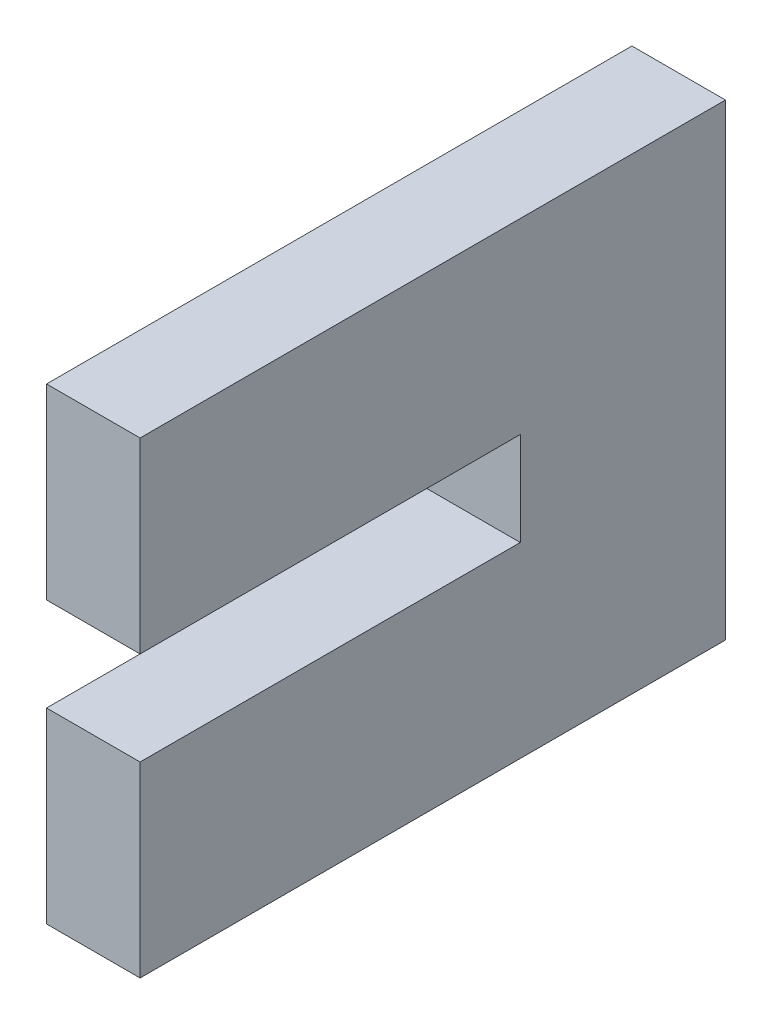
ISO-10303-21;
HEADER;
FILE_DESCRIPTION(('STEP AP214'),'2;1');
FILE_NAME('part.step','',(''),(''),'','','');
FILE_SCHEMA(('AUTOMOTIVE_DESIGN { 1 0 10303 214 1 1 1 1 }'));
ENDSEC;
DATA;
#1=APPLICATION_CONTEXT('core data for automotive mechanical design processes');
#2=APPLICATION_PROTOCOL_DEFINITION('international standard','automotive_design',2000,#1);
#3=PRODUCT_CONTEXT('',#1,'mechanical');
#4=PRODUCT('Part','Part','',(#3));
#5=PRODUCT_RELATED_PRODUCT_CATEGORY('part','',(#4));
#6=PRODUCT_DEFINITION_FORMATION('','',#4);
#7=PRODUCT_DEFINITION_CONTEXT('part definition',#1,'design');
#8=PRODUCT_DEFINITION('design','',#6,#7);
#9=PRODUCT_DEFINITION_SHAPE('','',#8);
#10=(LENGTH_UNIT() NAMED_UNIT(*) SI_UNIT(.MILLI.,.METRE.));
#11=(NAMED_UNIT(*) PLANE_ANGLE_UNIT() SI_UNIT($,.RADIAN.));
#12=(NAMED_UNIT(*) SI_UNIT($,.STERADIAN.) SOLID_ANGLE_UNIT());
#13=UNCERTAINTY_MEASURE_WITH_UNIT(LENGTH_MEASURE(1.E-05),#10,'distance_accuracy_value','');
#14=(GEOMETRIC_REPRESENTATION_CONTEXT(3) GLOBAL_UNCERTAINTY_ASSIGNED_CONTEXT((#13)) GLOBAL_UNIT_ASSIGNED_CONTEXT((#10,
#11,#12)) REPRESENTATION_CONTEXT('',''));
#15=CARTESIAN_POINT('',(0.,0.,0.));
#16=DIRECTION('',(0.,0.,1.));
#17=DIRECTION('',(1.,0.,0.));
#18=AXIS2_PLACEMENT_3D('',#15,#16,#17);
#19=CARTESIAN_POINT('',(4.,20.,13.8064516129032));
#20=DIRECTION('',(0.,-1.,0.));
#21=DIRECTION('',(0.,0.,-1.));
#22=AXIS2_PLACEMENT_3D('',#19,#20,#21);
#23=PLANE('',#22);
#24=DIRECTION('',(0.,0.,1.));
#25=VECTOR('',#24,1.);
#26=CARTESIAN_POINT('',(-4.,20.,13.8064516129032));
#27=LINE('',#26,#25);
#28=CARTESIAN_POINT('',(-4.,20.,-36.258064516129));
#29=VERTEX_POINT('',#28);
#30=CARTESIAN_POINT('',(-4.,20.,13.8064516129032));
#31=VERTEX_POINT('',#30);
#32=EDGE_CURVE('E146',#29,#31,#27,.T.);
#33=ORIENTED_EDGE('',*,*,#32,.T.);
#34=DIRECTION('',(-1.,0.,0.));
#35=VECTOR('',#34,1.);
#36=CARTESIAN_POINT('',(4.,20.,13.8064516129032));
#37=LINE('',#36,#35);
#38=CARTESIAN_POINT('',(4.,20.,13.8064516129032));
#39=VERTEX_POINT('',#38);
#40=EDGE_CURVE('E11',#39,#31,#37,.T.);
#41=ORIENTED_EDGE('',*,*,#40,.F.);
#42=DIRECTION('',(0.,0.,1.));
#43=VECTOR('',#42,1.);
#44=CARTESIAN_POINT('',(4.,20.,13.8064516129032));
#45=LINE('',#44,#43);
#46=CARTESIAN_POINT('',(4.,20.,-36.258064516129));
#47=VERTEX_POINT('',#46);
#48=EDGE_CURVE('E168',#47,#39,#45,.T.);
#49=ORIENTED_EDGE('',*,*,#48,.F.);
#50=DIRECTION('',(-1.,0.,0.));
#51=VECTOR('',#50,1.);
#52=CARTESIAN_POINT('',(4.,20.,-36.258064516129));
#53=LINE('',#52,#51);
#54=EDGE_CURVE('E142',#47,#29,#53,.T.);
#55=ORIENTED_EDGE('',*,*,#54,.T.);
#56=EDGE_LOOP('',(#33,#41,#49,#55));
#57=FACE_BOUND('',#56,.T.);
#58=ADVANCED_FACE('F45',(#57),#23,.F.);
#59=CARTESIAN_POINT('',(4.,3.99999999999999,13.8064516129032));
#60=DIRECTION('',(0.,0.,-1.));
#61=DIRECTION('',(-1.,0.,0.));
#62=AXIS2_PLACEMENT_3D('',#59,#60,#61);
#63=PLANE('',#62);
#64=DIRECTION('',(0.,-1.,0.));
#65=VECTOR('',#64,1.);
#66=CARTESIAN_POINT('',(-4.,3.99999999999999,13.8064516129032));
#67=LINE('',#66,#65);
#68=CARTESIAN_POINT('',(-4.,3.99999999999999,13.8064516129032));
#69=VERTEX_POINT('',#68);
#70=EDGE_CURVE('E150',#31,#69,#67,.T.);
#71=ORIENTED_EDGE('',*,*,#70,.T.);
#72=DIRECTION('',(-1.,0.,0.));
#73=VECTOR('',#72,1.);
#74=CARTESIAN_POINT('',(4.,3.99999999999999,13.8064516129032));
#75=LINE('',#74,#73);
#76=CARTESIAN_POINT('',(4.,3.99999999999999,13.8064516129032));
#77=VERTEX_POINT('',#76);
#78=EDGE_CURVE('E54',#77,#69,#75,.T.);
#79=ORIENTED_EDGE('',*,*,#78,.F.);
#80=DIRECTION('',(0.,-1.,0.));
#81=VECTOR('',#80,1.);
#82=CARTESIAN_POINT('',(4.,3.99999999999999,13.8064516129032));
#83=LINE('',#82,#81);
#84=EDGE_CURVE('E105',#39,#77,#83,.T.);
#85=ORIENTED_EDGE('',*,*,#84,.F.);
#86=ORIENTED_EDGE('',*,*,#40,.T.);
#87=EDGE_LOOP('',(#71,#79,#85,#86));
#88=FACE_BOUND('',#87,.T.);
#89=ADVANCED_FACE('F214',(#88),#63,.F.);
#90=CARTESIAN_POINT('',(4.,4.,-18.7096774193548));
#91=DIRECTION('',(0.,1.,0.));
#92=DIRECTION('',(0.,0.,1.));
#93=AXIS2_PLACEMENT_3D('',#90,#91,#92);
#94=PLANE('',#93);
#95=DIRECTION('',(0.,0.,-1.));
#96=VECTOR('',#95,1.);
#97=CARTESIAN_POINT('',(-4.,4.,-18.7096774193548));
#98=LINE('',#97,#96);
#99=CARTESIAN_POINT('',(-4.,4.,-18.7096774193548));
#100=VERTEX_POINT('',#99);
#101=EDGE_CURVE('E153',#69,#100,#98,.T.);
#102=ORIENTED_EDGE('',*,*,#101,.T.);
#103=DIRECTION('',(-1.,0.,0.));
#104=VECTOR('',#103,1.);
#105=CARTESIAN_POINT('',(4.,4.,-18.7096774193548));
#106=LINE('',#105,#104);
#107=CARTESIAN_POINT('',(4.,4.,-18.7096774193548));
#108=VERTEX_POINT('',#107);
#109=EDGE_CURVE('E179',#108,#100,#106,.T.);
#110=ORIENTED_EDGE('',*,*,#109,.F.);
#111=DIRECTION('',(0.,0.,-1.));
#112=VECTOR('',#111,1.);
#113=CARTESIAN_POINT('',(4.,4.,-18.7096774193548));
#114=LINE('',#113,#112);
#115=EDGE_CURVE('E189',#77,#108,#114,.T.);
#116=ORIENTED_EDGE('',*,*,#115,.F.);
#117=ORIENTED_EDGE('',*,*,#78,.T.);
#118=EDGE_LOOP('',(#102,#110,#116,#117));
#119=FACE_BOUND('',#118,.T.);
#120=ADVANCED_FACE('F187',(#119),#94,.F.);
#121=CARTESIAN_POINT('',(4.,-4.,-18.7096774193548));
#122=DIRECTION('',(0.,0.,-1.));
#123=DIRECTION('',(-1.,0.,0.));
#124=AXIS2_PLACEMENT_3D('',#121,#122,#123);
#125=PLANE('',#124);
#126=DIRECTION('',(0.,-1.,0.));
#127=VECTOR('',#126,1.);
#128=CARTESIAN_POINT('',(-4.,-4.,-18.7096774193548));
#129=LINE('',#128,#127);
#130=CARTESIAN_POINT('',(-4.,-4.,-18.7096774193548));
#131=VERTEX_POINT('',#130);
#132=EDGE_CURVE('E156',#100,#131,#129,.T.);
#133=ORIENTED_EDGE('',*,*,#132,.T.);
#134=DIRECTION('',(-1.,0.,0.));
#135=VECTOR('',#134,1.);
#136=CARTESIAN_POINT('',(4.,-4.,-18.7096774193548));
#137=LINE('',#136,#135);
#138=CARTESIAN_POINT('',(4.,-4.,-18.7096774193548));
#139=VERTEX_POINT('',#138);
#140=EDGE_CURVE('E175',#139,#131,#137,.T.);
#141=ORIENTED_EDGE('',*,*,#140,.F.);
#142=DIRECTION('',(0.,-1.,0.));
#143=VECTOR('',#142,1.);
#144=CARTESIAN_POINT('',(4.,-4.,-18.7096774193548));
#145=LINE('',#144,#143);
#146=EDGE_CURVE('E202',#108,#139,#145,.T.);
#147=ORIENTED_EDGE('',*,*,#146,.F.);
#148=ORIENTED_EDGE('',*,*,#109,.T.);
#149=EDGE_LOOP('',(#133,#141,#147,#148));
#150=FACE_BOUND('',#149,.T.);
#151=ADVANCED_FACE('F197',(#150),#125,.F.);
#152=CARTESIAN_POINT('',(4.,-4.,13.8064516129032));
#153=DIRECTION('',(0.,-1.,0.));
#154=DIRECTION('',(0.,0.,-1.));
#155=AXIS2_PLACEMENT_3D('',#152,#153,#154);
#156=PLANE('',#155);
#157=DIRECTION('',(0.,0.,1.));
#158=VECTOR('',#157,1.);
#159=CARTESIAN_POINT('',(-4.,-4.,13.8064516129032));
#160=LINE('',#159,#158);
#161=CARTESIAN_POINT('',(-4.,-4.,13.8064516129032));
#162=VERTEX_POINT('',#161);
#163=EDGE_CURVE('E159',#131,#162,#160,.T.);
#164=ORIENTED_EDGE('',*,*,#163,.T.);
#165=DIRECTION('',(-1.,0.,0.));
#166=VECTOR('',#165,1.);
#167=CARTESIAN_POINT('',(4.,-4.,13.8064516129032));
#168=LINE('',#167,#166);
#169=CARTESIAN_POINT('',(4.,-4.,13.8064516129032));
#170=VERTEX_POINT('',#169);
#171=EDGE_CURVE('E135',#170,#162,#168,.T.);
#172=ORIENTED_EDGE('',*,*,#171,.F.);
#173=DIRECTION('',(0.,0.,1.));
#174=VECTOR('',#173,1.);
#175=CARTESIAN_POINT('',(4.,-4.,13.8064516129032));
#176=LINE('',#175,#174);
#177=EDGE_CURVE('E124',#139,#170,#176,.T.);
#178=ORIENTED_EDGE('',*,*,#177,.F.);
#179=ORIENTED_EDGE('',*,*,#140,.T.);
#180=EDGE_LOOP('',(#164,#172,#178,#179));
#181=FACE_BOUND('',#180,.T.);
#182=ADVANCED_FACE('F200',(#181),#156,.F.);
#183=CARTESIAN_POINT('',(4.,-20.,13.8064516129032));
#184=DIRECTION('',(0.,0.,-1.));
#185=DIRECTION('',(-1.,0.,0.));
#186=AXIS2_PLACEMENT_3D('',#183,#184,#185);
#187=PLANE('',#186);
#188=DIRECTION('',(0.,-1.,0.));
#189=VECTOR('',#188,1.);
#190=CARTESIAN_POINT('',(-4.,-20.,13.8064516129032));
#191=LINE('',#190,#189);
#192=CARTESIAN_POINT('',(-4.,-20.,13.8064516129032));
#193=VERTEX_POINT('',#192);
#194=EDGE_CURVE('E133',#162,#193,#191,.T.);
#195=ORIENTED_EDGE('',*,*,#194,.T.);
#196=DIRECTION('',(-1.,0.,0.));
#197=VECTOR('',#196,1.);
#198=CARTESIAN_POINT('',(4.,-20.,13.8064516129032));
#199=LINE('',#198,#197);
#200=CARTESIAN_POINT('',(4.,-20.,13.8064516129032));
#201=VERTEX_POINT('',#200);
#202=EDGE_CURVE('E130',#201,#193,#199,.T.);
#203=ORIENTED_EDGE('',*,*,#202,.F.);
#204=DIRECTION('',(0.,-1.,0.));
#205=VECTOR('',#204,1.);
#206=CARTESIAN_POINT('',(4.,-20.,13.8064516129032));
#207=LINE('',#206,#205);
#208=EDGE_CURVE('E118',#170,#201,#207,.T.);
#209=ORIENTED_EDGE('',*,*,#208,.F.);
#210=ORIENTED_EDGE('',*,*,#171,.T.);
#211=EDGE_LOOP('',(#195,#203,#209,#210));
#212=FACE_BOUND('',#211,.T.);
#213=ADVANCED_FACE('F131',(#212),#187,.F.);
#214=CARTESIAN_POINT('',(4.,-20.,-36.258064516129));
#215=DIRECTION('',(0.,1.,0.));
#216=DIRECTION('',(0.,0.,1.));
#217=AXIS2_PLACEMENT_3D('',#214,#215,#216);
#218=PLANE('',#217);
#219=DIRECTION('',(0.,0.,-1.));
#220=VECTOR('',#219,1.);
#221=CARTESIAN_POINT('',(-4.,-20.,-36.258064516129));
#222=LINE('',#221,#220);
#223=CARTESIAN_POINT('',(-4.,-20.,-36.258064516129));
#224=VERTEX_POINT('',#223);
#225=EDGE_CURVE('E91',#193,#224,#222,.T.);
#226=ORIENTED_EDGE('',*,*,#225,.T.);
#227=DIRECTION('',(-1.,0.,0.));
#228=VECTOR('',#227,1.);
#229=CARTESIAN_POINT('',(4.,-20.,-36.258064516129));
#230=LINE('',#229,#228);
#231=CARTESIAN_POINT('',(4.,-20.,-36.258064516129));
#232=VERTEX_POINT('',#231);
#233=EDGE_CURVE('E136',#232,#224,#230,.T.);
#234=ORIENTED_EDGE('',*,*,#233,.F.);
#235=DIRECTION('',(0.,0.,-1.));
#236=VECTOR('',#235,1.);
#237=CARTESIAN_POINT('',(4.,-20.,-36.258064516129));
#238=LINE('',#237,#236);
#239=EDGE_CURVE('E122',#201,#232,#238,.T.);
#240=ORIENTED_EDGE('',*,*,#239,.F.);
#241=ORIENTED_EDGE('',*,*,#202,.T.);
#242=EDGE_LOOP('',(#226,#234,#240,#241));
#243=FACE_BOUND('',#242,.T.);
#244=ADVANCED_FACE('F138',(#243),#218,.F.);
#245=CARTESIAN_POINT('',(4.,20.,-36.258064516129));
#246=DIRECTION('',(0.,0.,1.));
#247=DIRECTION('',(1.,0.,0.));
#248=AXIS2_PLACEMENT_3D('',#245,#246,#247);
#249=PLANE('',#248);
#250=DIRECTION('',(0.,1.,0.));
#251=VECTOR('',#250,1.);
#252=CARTESIAN_POINT('',(-4.,20.,-36.258064516129));
#253=LINE('',#252,#251);
#254=EDGE_CURVE('E97',#224,#29,#253,.T.);
#255=ORIENTED_EDGE('',*,*,#254,.T.);
#256=ORIENTED_EDGE('',*,*,#54,.F.);
#257=DIRECTION('',(0.,1.,0.));
#258=VECTOR('',#257,1.);
#259=CARTESIAN_POINT('',(4.,20.,-36.258064516129));
#260=LINE('',#259,#258);
#261=EDGE_CURVE('E62',#232,#47,#260,.T.);
#262=ORIENTED_EDGE('',*,*,#261,.F.);
#263=ORIENTED_EDGE('',*,*,#233,.T.);
#264=EDGE_LOOP('',(#255,#256,#262,#263));
#265=FACE_BOUND('',#264,.T.);
#266=ADVANCED_FACE('F230',(#265),#249,.F.);
#267=CARTESIAN_POINT('',(4.,0.,0.));
#268=DIRECTION('',(-1.,0.,0.));
#269=DIRECTION('',(0.,0.,1.));
#270=AXIS2_PLACEMENT_3D('',#267,#268,#269);
#271=PLANE('',#270);
#272=ORIENTED_EDGE('',*,*,#48,.T.);
#273=ORIENTED_EDGE('',*,*,#84,.T.);
#274=ORIENTED_EDGE('',*,*,#115,.T.);
#275=ORIENTED_EDGE('',*,*,#146,.T.);
#276=ORIENTED_EDGE('',*,*,#177,.T.);
#277=ORIENTED_EDGE('',*,*,#208,.T.);
#278=ORIENTED_EDGE('',*,*,#239,.T.);
#279=ORIENTED_EDGE('',*,*,#261,.T.);
#280=EDGE_LOOP('',(#272,#273,#274,#275,#276,#277,#278,#279));
#281=FACE_BOUND('',#280,.T.);
#282=ADVANCED_FACE('F120',(#281),#271,.F.);
#283=CARTESIAN_POINT('',(-4.,0.,0.));
#284=DIRECTION('',(-1.,0.,0.));
#285=DIRECTION('',(0.,0.,1.));
#286=AXIS2_PLACEMENT_3D('',#283,#284,#285);
#287=PLANE('',#286);
#288=ORIENTED_EDGE('',*,*,#32,.F.);
#289=ORIENTED_EDGE('',*,*,#254,.F.);
#290=ORIENTED_EDGE('',*,*,#225,.F.);
#291=ORIENTED_EDGE('',*,*,#194,.F.);
#292=ORIENTED_EDGE('',*,*,#163,.F.);
#293=ORIENTED_EDGE('',*,*,#132,.F.);
#294=ORIENTED_EDGE('',*,*,#101,.F.);
#295=ORIENTED_EDGE('',*,*,#70,.F.);
#296=EDGE_LOOP('',(#288,#289,#290,#291,#292,#293,#294,#295));
#297=FACE_BOUND('',#296,.T.);
#298=ADVANCED_FACE('F193',(#297),#287,.T.);
#299=CLOSED_SHELL('',(#58,#89,#120,#151,#182,#213,#244,#266,#282,#298));
#300=MANIFOLD_SOLID_BREP('B2',#299);
#301=ADVANCED_BREP_SHAPE_REPRESENTATION('',(#18,#300),#14);
#302=SHAPE_DEFINITION_REPRESENTATION(#9,#301);
ENDSEC;
END-ISO-10303-21;
